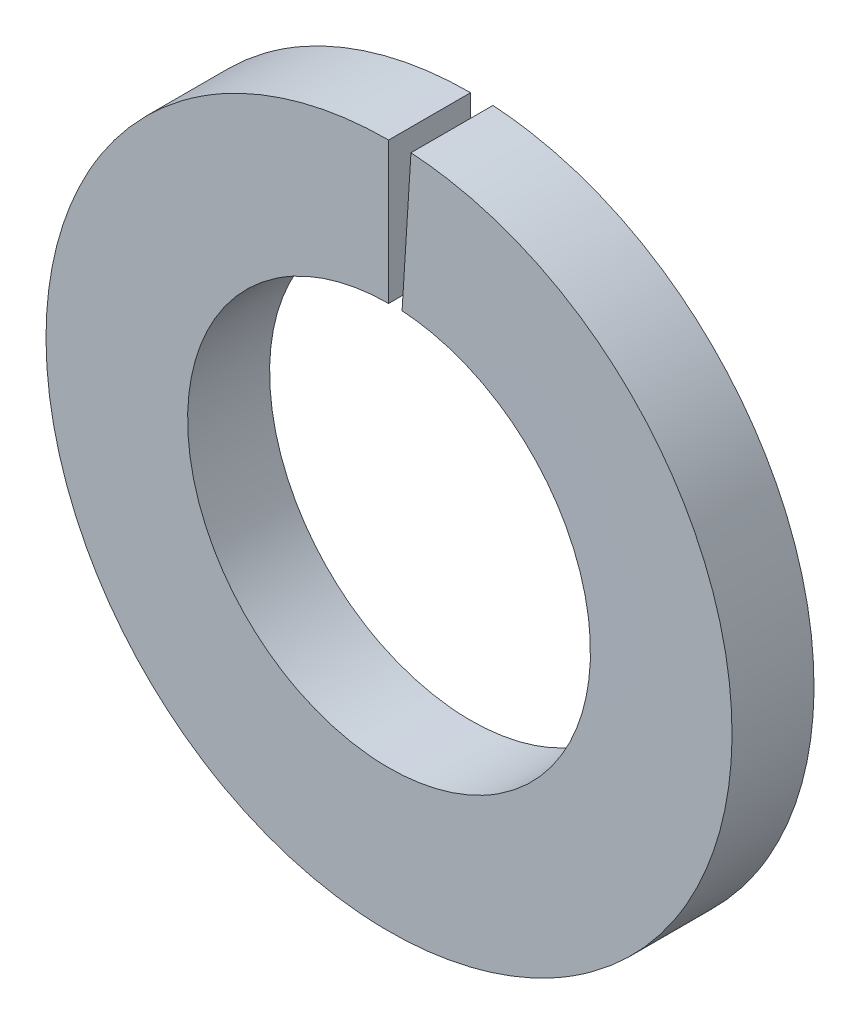
ISO-10303-21;
HEADER;
FILE_DESCRIPTION(('STEP AP214'),'2;1');
FILE_NAME('part.step','',(''),(''),'','','');
FILE_SCHEMA(('AUTOMOTIVE_DESIGN { 1 0 10303 214 1 1 1 1 }'));
ENDSEC;
DATA;
#1=APPLICATION_CONTEXT('core data for automotive mechanical design processes');
#2=APPLICATION_PROTOCOL_DEFINITION('international standard','automotive_design',2000,#1);
#3=PRODUCT_CONTEXT('',#1,'mechanical');
#4=PRODUCT('Part','Part','',(#3));
#5=PRODUCT_RELATED_PRODUCT_CATEGORY('part','',(#4));
#6=PRODUCT_DEFINITION_FORMATION('','',#4);
#7=PRODUCT_DEFINITION_CONTEXT('part definition',#1,'design');
#8=PRODUCT_DEFINITION('design','',#6,#7);
#9=PRODUCT_DEFINITION_SHAPE('','',#8);
#10=(LENGTH_UNIT() NAMED_UNIT(*) SI_UNIT(.MILLI.,.METRE.));
#11=(NAMED_UNIT(*) PLANE_ANGLE_UNIT() SI_UNIT($,.RADIAN.));
#12=(NAMED_UNIT(*) SI_UNIT($,.STERADIAN.) SOLID_ANGLE_UNIT());
#13=UNCERTAINTY_MEASURE_WITH_UNIT(LENGTH_MEASURE(1.E-05),#10,'distance_accuracy_value','');
#14=(GEOMETRIC_REPRESENTATION_CONTEXT(3) GLOBAL_UNCERTAINTY_ASSIGNED_CONTEXT((#13)) GLOBAL_UNIT_ASSIGNED_CONTEXT((#10,
#11,#12)) REPRESENTATION_CONTEXT('',''));
#15=CARTESIAN_POINT('',(0.,0.,0.));
#16=DIRECTION('',(0.,0.,1.));
#17=DIRECTION('',(1.,0.,0.));
#18=AXIS2_PLACEMENT_3D('',#15,#16,#17);
#19=CARTESIAN_POINT('',(0.,2.7,0.));
#20=DIRECTION('',(-1.,0.,0.));
#21=DIRECTION('',(0.,0.,1.));
#22=AXIS2_PLACEMENT_3D('',#19,#20,#21);
#23=PLANE('',#22);
#24=DIRECTION('',(0.,1.,0.));
#25=VECTOR('',#24,1.);
#26=CARTESIAN_POINT('',(0.,4.6,0.));
#27=LINE('',#26,#25);
#28=CARTESIAN_POINT('',(0.,2.7,0.));
#29=VERTEX_POINT('',#28);
#30=CARTESIAN_POINT('',(0.,4.6,0.));
#31=VERTEX_POINT('',#30);
#32=EDGE_CURVE('E73',#29,#31,#27,.T.);
#33=ORIENTED_EDGE('',*,*,#32,.T.);
#34=DIRECTION('',(0.,0.,1.));
#35=VECTOR('',#34,1.);
#36=CARTESIAN_POINT('',(0.,4.6,0.));
#37=LINE('',#36,#35);
#38=CARTESIAN_POINT('',(0.,4.6,1.1));
#39=VERTEX_POINT('',#38);
#40=EDGE_CURVE('E68',#31,#39,#37,.T.);
#41=ORIENTED_EDGE('',*,*,#40,.T.);
#42=DIRECTION('',(0.,-1.,0.));
#43=VECTOR('',#42,1.);
#44=CARTESIAN_POINT('',(0.,4.6,1.1));
#45=LINE('',#44,#43);
#46=CARTESIAN_POINT('',(0.,2.7,1.1));
#47=VERTEX_POINT('',#46);
#48=EDGE_CURVE('E85',#39,#47,#45,.T.);
#49=ORIENTED_EDGE('',*,*,#48,.T.);
#50=DIRECTION('',(0.,0.,-1.));
#51=VECTOR('',#50,1.);
#52=CARTESIAN_POINT('',(0.,2.7,0.));
#53=LINE('',#52,#51);
#54=EDGE_CURVE('E78',#47,#29,#53,.T.);
#55=ORIENTED_EDGE('',*,*,#54,.T.);
#56=EDGE_LOOP('',(#33,#41,#49,#55));
#57=FACE_BOUND('',#56,.T.);
#58=ADVANCED_FACE('F33',(#57),#23,.F.);
#59=CARTESIAN_POINT('',(0.16953440272911,2.69467216675634,-0.011));
#60=DIRECTION('',(-0.998026728428272,0.0627905195293,0.));
#61=DIRECTION('',(0.,0.,1.));
#62=AXIS2_PLACEMENT_3D('',#59,#60,#61);
#63=PLANE('',#62);
#64=DIRECTION('',(0.0627905195293,0.998026728428272,0.));
#65=VECTOR('',#64,1.);
#66=CARTESIAN_POINT('',(0.28883638983478,4.59092295077005,-0.011));
#67=LINE('',#66,#65);
#68=CARTESIAN_POINT('',(0.169534402729109,2.69467216675634,-0.011));
#69=VERTEX_POINT('',#68);
#70=CARTESIAN_POINT('',(0.288836389834778,4.59092295077005,-0.011));
#71=VERTEX_POINT('',#70);
#72=EDGE_CURVE('E47',#69,#71,#67,.T.);
#73=ORIENTED_EDGE('',*,*,#72,.F.);
#74=DIRECTION('',(0.,0.,-1.));
#75=VECTOR('',#74,1.);
#76=CARTESIAN_POINT('',(0.16953440272911,2.69467216675634,-0.011));
#77=LINE('',#76,#75);
#78=CARTESIAN_POINT('',(0.169534402729154,2.69467216675633,1.089));
#79=VERTEX_POINT('',#78);
#80=EDGE_CURVE('E56',#79,#69,#77,.T.);
#81=ORIENTED_EDGE('',*,*,#80,.F.);
#82=DIRECTION('',(-0.0627905195293,-0.998026728428272,0.));
#83=VECTOR('',#82,1.);
#84=CARTESIAN_POINT('',(0.28883638983478,4.59092295077005,1.089));
#85=LINE('',#84,#83);
#86=CARTESIAN_POINT('',(0.288836389834855,4.59092295077005,1.089));
#87=VERTEX_POINT('',#86);
#88=EDGE_CURVE('E93',#87,#79,#85,.T.);
#89=ORIENTED_EDGE('',*,*,#88,.F.);
#90=DIRECTION('',(0.,0.,1.));
#91=VECTOR('',#90,1.);
#92=CARTESIAN_POINT('',(0.28883638983478,4.59092295077005,-0.011));
#93=LINE('',#92,#91);
#94=EDGE_CURVE('E11',#71,#87,#93,.T.);
#95=ORIENTED_EDGE('',*,*,#94,.F.);
#96=EDGE_LOOP('',(#73,#81,#89,#95));
#97=FACE_BOUND('',#96,.T.);
#98=ADVANCED_FACE('F143',(#97),#63,.T.);
#99=CARTESIAN_POINT('',(0.,4.6,1.1));
#100=CARTESIAN_POINT('',(-2.62379367649715,4.6,1.09908333333333));
#101=CARTESIAN_POINT('',(-3.95941332421813,2.34159051245172,1.09816666666667));
#102=CARTESIAN_POINT('',(-5.29503297193912,0.0831810249034416,1.09725));
#103=CARTESIAN_POINT('',(-4.03101072820179,-2.21606690086786,1.09633333333333));
#104=CARTESIAN_POINT('',(-2.76698848446445,-4.51531482663917,1.09541666666667));
#105=CARTESIAN_POINT('',(-0.144489491759435,-4.59773017768236,1.0945));
#106=CARTESIAN_POINT('',(2.47800950094558,-4.68014552872556,1.09358333333333));
#107=CARTESIAN_POINT('',(3.88390845730924,-2.46480325690343,1.09266666666667));
#108=CARTESIAN_POINT('',(5.28980741367289,-0.249460985081314,1.09175));
#109=CARTESIAN_POINT('',(4.09863001126653,2.08835629880185,1.09083333333333));
#110=CARTESIAN_POINT('',(2.90745260886016,4.42617358268501,1.08991666666667));
#111=CARTESIAN_POINT('',(0.288836389834931,4.59092295077004,1.089));
#112=CARTESIAN_POINT('',(0.,2.7,1.1));
#113=CARTESIAN_POINT('',(-1.54005281011789,2.7,1.09908333333333));
#114=CARTESIAN_POINT('',(-2.32400347291064,1.37441182252601,1.09816666666667));
#115=CARTESIAN_POINT('',(-3.1079541357034,0.0488236450520201,1.09725));
#116=CARTESIAN_POINT('',(-2.36602803611844,-1.30073492007462,1.09633333333333));
#117=CARTESIAN_POINT('',(-1.62410193653348,-2.65029348520125,1.09541666666667));
#118=CARTESIAN_POINT('',(-0.0848090495109726,-2.69866771298747,1.0945));
#119=CARTESIAN_POINT('',(1.45448383751154,-2.7470419407737,1.09358333333333));
#120=CARTESIAN_POINT('',(2.27968539885542,-1.44673234644332,1.09266666666667));
#121=CARTESIAN_POINT('',(3.10488696019931,-0.146422752112945,1.09175));
#122=CARTESIAN_POINT('',(2.40571761530861,1.22577434929674,1.09083333333333));
#123=CARTESIAN_POINT('',(1.70654827041792,2.59797145070642,1.08991666666667));
#124=CARTESIAN_POINT('',(0.169534402729198,2.69467216675633,1.089));
#125=(BOUNDED_SURFACE() B_SPLINE_SURFACE(1,2,((#99,#100,#101,#102,#103,#104,#105,#106,#107,#108,
#109,#110,#111),(#112,#113,#114,#115,#116,#117,#118,#119,#120,#121,#122,#123,#124)),
.UNSPECIFIED.,.F.,.F.,.F.) B_SPLINE_SURFACE_WITH_KNOTS((2,2),(3,2,2,2,2,2,3),(0.,1.),(0.,
0.166666666666667,0.333333333333333,0.5,0.666666666666667,0.833333333333333,1.),
.UNSPECIFIED.) GEOMETRIC_REPRESENTATION_ITEM() RATIONAL_B_SPLINE_SURFACE(((1.,0.868631514438192,
1.,0.868631514438192,1.,0.868631514438192,1.,0.868631514438192,1.,0.868631514438192,1.,
0.868631514438192,1.),(1.,0.868631514438192,1.,0.868631514438192,1.,0.868631514438192,1.,
0.868631514438192,1.,0.868631514438192,1.,0.868631514438192,1.))) REPRESENTATION_ITEM('') SURFACE());
#126=CARTESIAN_POINT('',(0.,2.7,1.1));
#127=CARTESIAN_POINT('',(-1.54005281011789,2.7,1.09908333333333));
#128=CARTESIAN_POINT('',(-2.32400347291064,1.37441182252601,1.09816666666667));
#129=CARTESIAN_POINT('',(-3.1079541357034,0.0488236450520201,1.09725));
#130=CARTESIAN_POINT('',(-2.36602803611844,-1.30073492007462,1.09633333333333));
#131=CARTESIAN_POINT('',(-1.62410193653348,-2.65029348520125,1.09541666666667));
#132=CARTESIAN_POINT('',(-0.0848090495109726,-2.69866771298747,1.0945));
#133=CARTESIAN_POINT('',(1.45448383751154,-2.7470419407737,1.09358333333333));
#134=CARTESIAN_POINT('',(2.27968539885542,-1.44673234644332,1.09266666666667));
#135=CARTESIAN_POINT('',(3.10488696019931,-0.146422752112945,1.09175));
#136=CARTESIAN_POINT('',(2.40571761530861,1.22577434929674,1.09083333333333));
#137=CARTESIAN_POINT('',(1.70654827041792,2.59797145070642,1.08991666666667));
#138=CARTESIAN_POINT('',(0.169534402729198,2.69467216675633,1.089));
#139=(BOUNDED_CURVE() B_SPLINE_CURVE(2,(#126,#127,#128,#129,#130,#131,#132,#133,#134,#135,#136,
#137,#138),.UNSPECIFIED.,.F.,.F.) B_SPLINE_CURVE_WITH_KNOTS((3,2,2,2,2,2,3),(0.,
0.166666666666667,0.333333333333333,0.5,0.666666666666667,0.833333333333333,1.),
.UNSPECIFIED.) CURVE() GEOMETRIC_REPRESENTATION_ITEM() RATIONAL_B_SPLINE_CURVE((1.,
0.868631514438192,1.,0.868631514438192,1.,0.868631514438192,1.,0.868631514438192,1.,
0.868631514438192,1.,0.868631514438192,1.)) REPRESENTATION_ITEM(''));
#140=EDGE_CURVE('E88',#47,#79,#139,.T.);
#141=CARTESIAN_POINT('',(0.,4.6,1.1));
#142=CARTESIAN_POINT('',(-2.62379367649715,4.6,1.09908333333333));
#143=CARTESIAN_POINT('',(-3.95941332421813,2.34159051245172,1.09816666666667));
#144=CARTESIAN_POINT('',(-5.29503297193912,0.0831810249034416,1.09725));
#145=CARTESIAN_POINT('',(-4.03101072820179,-2.21606690086786,1.09633333333333));
#146=CARTESIAN_POINT('',(-2.76698848446445,-4.51531482663917,1.09541666666667));
#147=CARTESIAN_POINT('',(-0.144489491759435,-4.59773017768236,1.0945));
#148=CARTESIAN_POINT('',(2.47800950094558,-4.68014552872556,1.09358333333333));
#149=CARTESIAN_POINT('',(3.88390845730924,-2.46480325690343,1.09266666666667));
#150=CARTESIAN_POINT('',(5.28980741367289,-0.249460985081314,1.09175));
#151=CARTESIAN_POINT('',(4.09863001126653,2.08835629880185,1.09083333333333));
#152=CARTESIAN_POINT('',(2.90745260886016,4.42617358268501,1.08991666666667));
#153=CARTESIAN_POINT('',(0.288836389834931,4.59092295077004,1.089));
#154=(BOUNDED_CURVE() B_SPLINE_CURVE(2,(#141,#142,#143,#144,#145,#146,#147,#148,#149,#150,#151,
#152,#153),.UNSPECIFIED.,.F.,.F.) B_SPLINE_CURVE_WITH_KNOTS((3,2,2,2,2,2,3),(0.,
0.166666666666667,0.333333333333333,0.5,0.666666666666667,0.833333333333333,1.),
.UNSPECIFIED.) CURVE() GEOMETRIC_REPRESENTATION_ITEM() RATIONAL_B_SPLINE_CURVE((1.,
0.868631514438192,1.,0.868631514438192,1.,0.868631514438192,1.,0.868631514438192,1.,
0.868631514438192,1.,0.868631514438192,1.)) REPRESENTATION_ITEM(''));
#155=EDGE_CURVE('E87',#39,#87,#154,.T.);
#156=ORIENTED_EDGE('',*,*,#140,.F.);
#157=ORIENTED_EDGE('',*,*,#48,.F.);
#158=ORIENTED_EDGE('',*,*,#155,.T.);
#159=ORIENTED_EDGE('',*,*,#88,.T.);
#160=EDGE_LOOP('',(#156,#157,#158,#159));
#161=FACE_BOUND('',#160,.T.);
#162=ADVANCED_FACE('F86',(#161),#125,.F.);
#163=CARTESIAN_POINT('',(0.,0.,0.));
#164=DIRECTION('',(0.,0.,-1.));
#165=DIRECTION('',(-1.,0.,0.));
#166=AXIS2_PLACEMENT_3D('',#163,#164,#165);
#167=CYLINDRICAL_SURFACE('',#166,2.7);
#168=CARTESIAN_POINT('',(0.,2.7,0.));
#169=CARTESIAN_POINT('',(-1.5400528101179,2.7,-0.000916666666666667));
#170=CARTESIAN_POINT('',(-2.32400347291065,1.374411822526,-0.00183333333333333));
#171=CARTESIAN_POINT('',(-3.1079541357034,0.0488236450519939,-0.00275));
#172=CARTESIAN_POINT('',(-2.36602803611843,-1.30073492007464,-0.00366666666666667));
#173=CARTESIAN_POINT('',(-1.62410193653345,-2.65029348520128,-0.00458333333333333));
#174=CARTESIAN_POINT('',(-0.0848090495109271,-2.69866771298748,-0.0055));
#175=CARTESIAN_POINT('',(1.45448383751159,-2.74704194077367,-0.00641666666666667));
#176=CARTESIAN_POINT('',(2.27968539885545,-1.44673234644327,-0.00733333333333333));
#177=CARTESIAN_POINT('',(3.10488696019931,-0.146422752112866,-0.00825));
#178=CARTESIAN_POINT('',(2.40571761530858,1.2257743492968,-0.00916666666666667));
#179=CARTESIAN_POINT('',(1.70654827041784,2.59797145070648,-0.0100833333333333));
#180=CARTESIAN_POINT('',(0.169534402729108,2.69467216675634,-0.011));
#181=(BOUNDED_CURVE() B_SPLINE_CURVE(2,(#168,#169,#170,#171,#172,#173,#174,#175,#176,#177,#178,
#179,#180),.UNSPECIFIED.,.F.,.F.) B_SPLINE_CURVE_WITH_KNOTS((3,2,2,2,2,2,3),(0.,
0.166666666666667,0.333333333333333,0.5,0.666666666666667,0.833333333333333,1.),
.UNSPECIFIED.) CURVE() GEOMETRIC_REPRESENTATION_ITEM() RATIONAL_B_SPLINE_CURVE((1.,
0.868631514438191,1.,0.868631514438191,1.,0.868631514438191,1.,0.868631514438191,1.,
0.868631514438191,1.,0.868631514438191,1.)) REPRESENTATION_ITEM(''));
#182=EDGE_CURVE('E108',#29,#69,#181,.T.);
#183=ORIENTED_EDGE('',*,*,#182,.F.);
#184=ORIENTED_EDGE('',*,*,#54,.F.);
#185=ORIENTED_EDGE('',*,*,#140,.T.);
#186=ORIENTED_EDGE('',*,*,#80,.T.);
#187=EDGE_LOOP('',(#183,#184,#185,#186));
#188=FACE_BOUND('',#187,.T.);
#189=ADVANCED_FACE('F126',(#188),#167,.F.);
#190=CARTESIAN_POINT('',(0.,2.7,0.));
#191=CARTESIAN_POINT('',(-1.5400528101179,2.7,-0.000916666666666667));
#192=CARTESIAN_POINT('',(-2.32400347291065,1.374411822526,-0.00183333333333333));
#193=CARTESIAN_POINT('',(-3.1079541357034,0.0488236450519939,-0.00275));
#194=CARTESIAN_POINT('',(-2.36602803611843,-1.30073492007464,-0.00366666666666667));
#195=CARTESIAN_POINT('',(-1.62410193653345,-2.65029348520128,-0.00458333333333333));
#196=CARTESIAN_POINT('',(-0.0848090495109271,-2.69866771298748,-0.0055));
#197=CARTESIAN_POINT('',(1.45448383751159,-2.74704194077367,-0.00641666666666667));
#198=CARTESIAN_POINT('',(2.27968539885545,-1.44673234644327,-0.00733333333333333));
#199=CARTESIAN_POINT('',(3.10488696019931,-0.146422752112866,-0.00825));
#200=CARTESIAN_POINT('',(2.40571761530858,1.2257743492968,-0.00916666666666667));
#201=CARTESIAN_POINT('',(1.70654827041784,2.59797145070648,-0.0100833333333333));
#202=CARTESIAN_POINT('',(0.169534402729108,2.69467216675634,-0.011));
#203=CARTESIAN_POINT('',(0.,4.6,0.));
#204=CARTESIAN_POINT('',(-2.62379367649716,4.6,-0.000916666666666667));
#205=CARTESIAN_POINT('',(-3.95941332421815,2.3415905124517,-0.00183333333333333));
#206=CARTESIAN_POINT('',(-5.29503297193913,0.0831810249033971,-0.00275));
#207=CARTESIAN_POINT('',(-4.03101072820176,-2.21606690086791,-0.00366666666666667));
#208=CARTESIAN_POINT('',(-2.7669884844644,-4.51531482663922,-0.00458333333333333));
#209=CARTESIAN_POINT('',(-0.144489491759357,-4.59773017768237,-0.0055));
#210=CARTESIAN_POINT('',(2.47800950094568,-4.68014552872552,-0.00641666666666667));
#211=CARTESIAN_POINT('',(3.88390845730929,-2.46480325690335,-0.00733333333333333));
#212=CARTESIAN_POINT('',(5.28980741367291,-0.249460985081178,-0.00825));
#213=CARTESIAN_POINT('',(4.09863001126647,2.08835629880196,-0.00916666666666667));
#214=CARTESIAN_POINT('',(2.90745260886003,4.4261735826851,-0.0100833333333333));
#215=CARTESIAN_POINT('',(0.288836389834776,4.59092295077005,-0.011));
#216=(BOUNDED_SURFACE() B_SPLINE_SURFACE(1,2,((#190,#191,#192,#193,#194,#195,#196,#197,#198,
#199,#200,#201,#202),(#203,#204,#205,#206,#207,#208,#209,#210,#211,#212,#213,#214,#215)),
.UNSPECIFIED.,.F.,.F.,.F.) B_SPLINE_SURFACE_WITH_KNOTS((2,2),(3,2,2,2,2,2,3),(0.,1.),(0.,
0.166666666666667,0.333333333333333,0.5,0.666666666666667,0.833333333333333,1.),
.UNSPECIFIED.) GEOMETRIC_REPRESENTATION_ITEM() RATIONAL_B_SPLINE_SURFACE(((1.,0.868631514438191,
1.,0.868631514438191,1.,0.868631514438191,1.,0.868631514438191,1.,0.868631514438191,1.,
0.868631514438191,1.),(1.,0.868631514438191,1.,0.868631514438191,1.,0.868631514438191,1.,
0.868631514438191,1.,0.868631514438191,1.,0.868631514438191,1.))) REPRESENTATION_ITEM('') SURFACE());
#217=CARTESIAN_POINT('',(0.,4.6,0.));
#218=CARTESIAN_POINT('',(-2.62379367649716,4.6,-0.000916666666666667));
#219=CARTESIAN_POINT('',(-3.95941332421815,2.3415905124517,-0.00183333333333333));
#220=CARTESIAN_POINT('',(-5.29503297193913,0.0831810249033971,-0.00275));
#221=CARTESIAN_POINT('',(-4.03101072820176,-2.21606690086791,-0.00366666666666667));
#222=CARTESIAN_POINT('',(-2.7669884844644,-4.51531482663922,-0.00458333333333333));
#223=CARTESIAN_POINT('',(-0.144489491759357,-4.59773017768237,-0.0055));
#224=CARTESIAN_POINT('',(2.47800950094568,-4.68014552872552,-0.00641666666666667));
#225=CARTESIAN_POINT('',(3.88390845730929,-2.46480325690335,-0.00733333333333333));
#226=CARTESIAN_POINT('',(5.28980741367291,-0.249460985081178,-0.00825));
#227=CARTESIAN_POINT('',(4.09863001126647,2.08835629880196,-0.00916666666666667));
#228=CARTESIAN_POINT('',(2.90745260886003,4.4261735826851,-0.0100833333333333));
#229=CARTESIAN_POINT('',(0.288836389834776,4.59092295077005,-0.011));
#230=(BOUNDED_CURVE() B_SPLINE_CURVE(2,(#217,#218,#219,#220,#221,#222,#223,#224,#225,#226,#227,
#228,#229),.UNSPECIFIED.,.F.,.F.) B_SPLINE_CURVE_WITH_KNOTS((3,2,2,2,2,2,3),(0.,
0.166666666666667,0.333333333333333,0.5,0.666666666666667,0.833333333333333,1.),
.UNSPECIFIED.) CURVE() GEOMETRIC_REPRESENTATION_ITEM() RATIONAL_B_SPLINE_CURVE((1.,
0.868631514438191,1.,0.868631514438191,1.,0.868631514438191,1.,0.868631514438191,1.,
0.868631514438191,1.,0.868631514438191,1.)) REPRESENTATION_ITEM(''));
#231=EDGE_CURVE('E40',#31,#71,#230,.T.);
#232=ORIENTED_EDGE('',*,*,#231,.F.);
#233=ORIENTED_EDGE('',*,*,#32,.F.);
#234=ORIENTED_EDGE('',*,*,#182,.T.);
#235=ORIENTED_EDGE('',*,*,#72,.T.);
#236=EDGE_LOOP('',(#232,#233,#234,#235));
#237=FACE_BOUND('',#236,.T.);
#238=ADVANCED_FACE('F124',(#237),#216,.F.);
#239=CARTESIAN_POINT('',(0.,0.,0.));
#240=DIRECTION('',(0.,0.,-1.));
#241=DIRECTION('',(-1.,0.,0.));
#242=AXIS2_PLACEMENT_3D('',#239,#240,#241);
#243=CYLINDRICAL_SURFACE('',#242,4.6);
#244=ORIENTED_EDGE('',*,*,#94,.T.);
#245=ORIENTED_EDGE('',*,*,#155,.F.);
#246=ORIENTED_EDGE('',*,*,#40,.F.);
#247=ORIENTED_EDGE('',*,*,#231,.T.);
#248=EDGE_LOOP('',(#244,#245,#246,#247));
#249=FACE_BOUND('',#248,.T.);
#250=ADVANCED_FACE('F91',(#249),#243,.T.);
#251=CLOSED_SHELL('',(#58,#98,#162,#189,#238,#250));
#252=MANIFOLD_SOLID_BREP('B2',#251);
#253=ADVANCED_BREP_SHAPE_REPRESENTATION('',(#18,#252),#14);
#254=SHAPE_DEFINITION_REPRESENTATION(#9,#253);
ENDSEC;
END-ISO-10303-21;
